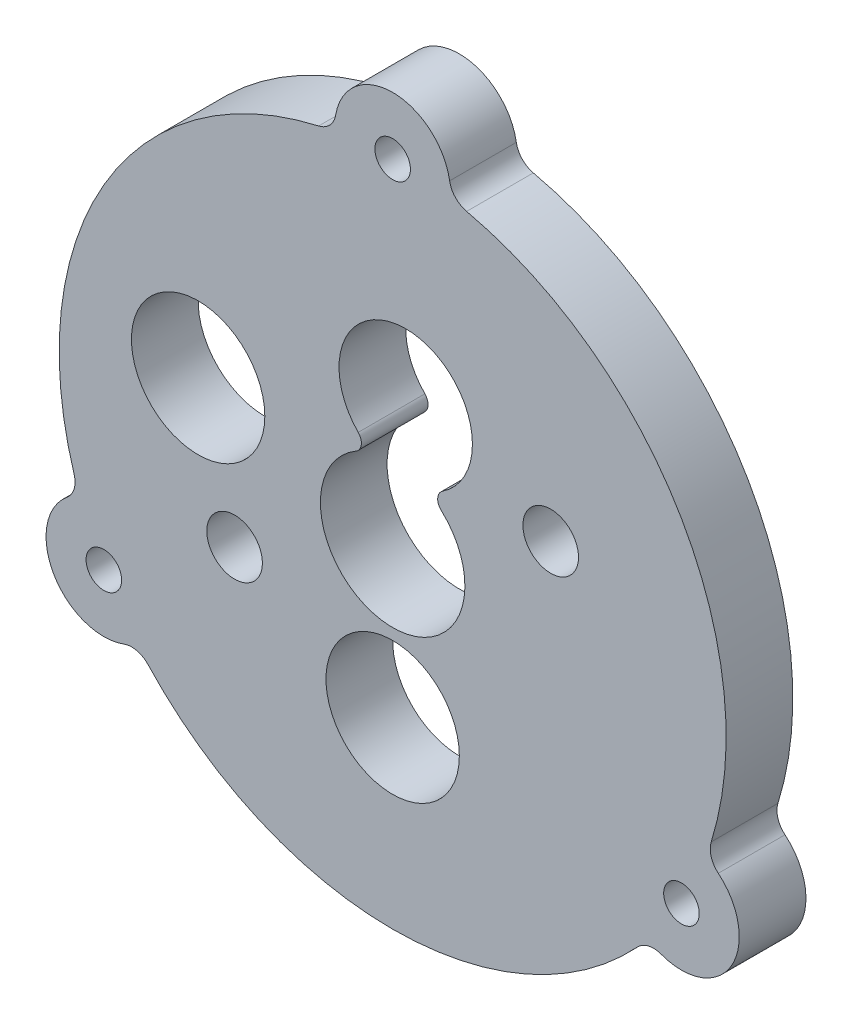
ISO-10303-21;
HEADER;
FILE_DESCRIPTION(('STEP AP214'),'2;1');
FILE_NAME('part.step','',(''),(''),'','','');
FILE_SCHEMA(('AUTOMOTIVE_DESIGN { 1 0 10303 214 1 1 1 1 }'));
ENDSEC;
DATA;
#1=APPLICATION_CONTEXT('core data for automotive mechanical design processes');
#2=APPLICATION_PROTOCOL_DEFINITION('international standard','automotive_design',2000,#1);
#3=PRODUCT_CONTEXT('',#1,'mechanical');
#4=PRODUCT('Part','Part','',(#3));
#5=PRODUCT_RELATED_PRODUCT_CATEGORY('part','',(#4));
#6=PRODUCT_DEFINITION_FORMATION('','',#4);
#7=PRODUCT_DEFINITION_CONTEXT('part definition',#1,'design');
#8=PRODUCT_DEFINITION('design','',#6,#7);
#9=PRODUCT_DEFINITION_SHAPE('','',#8);
#10=(LENGTH_UNIT() NAMED_UNIT(*) SI_UNIT(.MILLI.,.METRE.));
#11=(NAMED_UNIT(*) PLANE_ANGLE_UNIT() SI_UNIT($,.RADIAN.));
#12=(NAMED_UNIT(*) SI_UNIT($,.STERADIAN.) SOLID_ANGLE_UNIT());
#13=UNCERTAINTY_MEASURE_WITH_UNIT(LENGTH_MEASURE(1.E-05),#10,'distance_accuracy_value','');
#14=(GEOMETRIC_REPRESENTATION_CONTEXT(3) GLOBAL_UNCERTAINTY_ASSIGNED_CONTEXT((#13)) GLOBAL_UNIT_ASSIGNED_CONTEXT((#10,
#11,#12)) REPRESENTATION_CONTEXT('',''));
#15=CARTESIAN_POINT('',(0.,0.,0.));
#16=DIRECTION('',(0.,0.,1.));
#17=DIRECTION('',(1.,0.,0.));
#18=AXIS2_PLACEMENT_3D('',#15,#16,#17);
#19=CARTESIAN_POINT('',(6.49519052838329,-3.75,3.));
#20=DIRECTION('',(0.,0.,1.));
#21=DIRECTION('',(1.,0.,0.));
#22=AXIS2_PLACEMENT_3D('',#19,#20,#21);
#23=PLANE('',#22);
#24=CARTESIAN_POINT('',(-12.9903810567665,-7.50000000000007,3.));
#25=DIRECTION('',(0.,0.,1.));
#26=DIRECTION('',(1.,0.,0.));
#27=AXIS2_PLACEMENT_3D('',#24,#25,#26);
#28=CIRCLE('',#27,0.799999999999999);
#29=CARTESIAN_POINT('',(-12.1903810567665,-7.50000000000007,3.));
#30=VERTEX_POINT('',#29);
#31=EDGE_CURVE('E387',#30,#30,#28,.T.);
#32=ORIENTED_EDGE('',*,*,#31,.F.);
#33=EDGE_LOOP('',(#32));
#34=FACE_BOUND('',#33,.T.);
#35=CARTESIAN_POINT('',(0.,15.,3.));
#36=DIRECTION('',(0.,0.,1.));
#37=DIRECTION('',(1.,0.,0.));
#38=AXIS2_PLACEMENT_3D('',#35,#36,#37);
#39=CIRCLE('',#38,0.8);
#40=CARTESIAN_POINT('',(0.799999999999931,15.,3.));
#41=VERTEX_POINT('',#40);
#42=EDGE_CURVE('E399',#41,#41,#39,.T.);
#43=ORIENTED_EDGE('',*,*,#42,.F.);
#44=EDGE_LOOP('',(#43));
#45=FACE_BOUND('',#44,.T.);
#46=CARTESIAN_POINT('',(0.587451619357943,5.6861328633508,3.));
#47=DIRECTION('',(0.,0.,1.));
#48=DIRECTION('',(1.,0.,0.));
#49=AXIS2_PLACEMENT_3D('',#46,#47,#48);
#50=CIRCLE('',#49,3.);
#51=CARTESIAN_POINT('',(2.24883958940588,3.18817569538734,3.));
#52=VERTEX_POINT('',#51);
#53=CARTESIAN_POINT('',(-1.5495371156463,3.58059750471514,3.));
#54=VERTEX_POINT('',#53);
#55=EDGE_CURVE('E411',#52,#54,#50,.T.);
#56=ORIENTED_EDGE('',*,*,#55,.F.);
#57=CARTESIAN_POINT('',(2.52573758441387,2.77184950072676,3.));
#58=DIRECTION('',(0.,0.,1.));
#59=DIRECTION('',(1.,0.,0.));
#60=AXIS2_PLACEMENT_3D('',#57,#58,#59);
#61=CIRCLE('',#60,0.5);
#62=CARTESIAN_POINT('',(2.18897257315868,2.40226956729653,3.));
#63=VERTEX_POINT('',#62);
#64=EDGE_CURVE('E189',#52,#63,#61,.T.);
#65=ORIENTED_EDGE('',*,*,#64,.T.);
#66=CARTESIAN_POINT('',(0.,0.,3.));
#67=DIRECTION('',(0.,0.,1.));
#68=DIRECTION('',(1.,0.,0.));
#69=AXIS2_PLACEMENT_3D('',#66,#67,#68);
#70=CIRCLE('',#69,3.25);
#71=CARTESIAN_POINT('',(-1.65160831750518,2.79905161895019,3.));
#72=VERTEX_POINT('',#71);
#73=EDGE_CURVE('E409',#72,#63,#70,.T.);
#74=ORIENTED_EDGE('',*,*,#73,.F.);
#75=CARTESIAN_POINT('',(-1.90570190481367,3.22967494494253,3.));
#76=DIRECTION('',(0.,0.,1.));
#77=DIRECTION('',(1.,0.,0.));
#78=AXIS2_PLACEMENT_3D('',#75,#76,#77);
#79=CIRCLE('',#78,0.5);
#80=EDGE_CURVE('E172',#72,#54,#79,.T.);
#81=ORIENTED_EDGE('',*,*,#80,.T.);
#82=EDGE_LOOP('',(#56,#65,#74,#81));
#83=FACE_BOUND('',#82,.T.);
#84=CARTESIAN_POINT('',(-7.10922589184212,-3.66863833305516,3.));
#85=DIRECTION('',(0.,0.,1.));
#86=DIRECTION('',(1.,0.,0.));
#87=AXIS2_PLACEMENT_3D('',#84,#85,#86);
#88=CIRCLE('',#87,1.25);
#89=CARTESIAN_POINT('',(-5.85922589184212,-3.66863833305516,3.));
#90=VERTEX_POINT('',#89);
#91=EDGE_CURVE('E416',#90,#90,#88,.T.);
#92=ORIENTED_EDGE('',*,*,#91,.F.);
#93=EDGE_LOOP('',(#92));
#94=FACE_BOUND('',#93,.T.);
#95=CARTESIAN_POINT('',(-12.9903810567665,-7.50000000000007,3.));
#96=DIRECTION('',(0.,0.,1.));
#97=DIRECTION('',(-1.,0.,0.));
#98=AXIS2_PLACEMENT_3D('',#95,#96,#97);
#99=CIRCLE('',#98,2.6);
#100=CARTESIAN_POINT('',(-14.6482284902248,-5.49711660664538,3.));
#101=VERTEX_POINT('',#100);
#102=CARTESIAN_POINT('',(-12.0847568740325,-9.93717968965105,3.));
#103=VERTEX_POINT('',#102);
#104=EDGE_CURVE('E173',#101,#103,#99,.T.);
#105=ORIENTED_EDGE('',*,*,#104,.T.);
#106=CARTESIAN_POINT('',(-11.7364398806732,-10.874556493363,3.));
#107=DIRECTION('',(0.,0.,1.));
#108=DIRECTION('',(1.,0.,0.));
#109=AXIS2_PLACEMENT_3D('',#106,#107,#108);
#110=CIRCLE('',#109,1.);
#111=CARTESIAN_POINT('',(-11.0029123881312,-10.1948967125278,3.));
#112=VERTEX_POINT('',#111);
#113=EDGE_CURVE('E222',#103,#112,#110,.F.);
#114=ORIENTED_EDGE('',*,*,#113,.T.);
#115=CARTESIAN_POINT('',(0.,0.,3.));
#116=DIRECTION('',(0.,0.,1.));
#117=DIRECTION('',(1.,0.,0.));
#118=AXIS2_PLACEMENT_3D('',#115,#116,#117);
#119=CIRCLE('',#118,15.);
#120=CARTESIAN_POINT('',(11.0029123881312,-10.1948967125277,3.));
#121=VERTEX_POINT('',#120);
#122=EDGE_CURVE('E278',#112,#121,#119,.T.);
#123=ORIENTED_EDGE('',*,*,#122,.T.);
#124=CARTESIAN_POINT('',(11.7364398806733,-10.8745564933629,3.));
#125=DIRECTION('',(0.,0.,1.));
#126=DIRECTION('',(1.,0.,0.));
#127=AXIS2_PLACEMENT_3D('',#124,#125,#126);
#128=CIRCLE('',#127,1.);
#129=CARTESIAN_POINT('',(12.0847568740325,-9.93717968965099,3.));
#130=VERTEX_POINT('',#129);
#131=EDGE_CURVE('E55',#121,#130,#128,.F.);
#132=ORIENTED_EDGE('',*,*,#131,.T.);
#133=CARTESIAN_POINT('',(12.9903810567666,-7.50000000000001,3.));
#134=DIRECTION('',(0.,0.,1.));
#135=DIRECTION('',(-1.,0.,0.));
#136=AXIS2_PLACEMENT_3D('',#133,#134,#135);
#137=CIRCLE('',#136,2.59999999999999);
#138=CARTESIAN_POINT('',(14.6482284902248,-5.49711660664532,3.));
#139=VERTEX_POINT('',#138);
#140=EDGE_CURVE('E282',#130,#139,#137,.T.);
#141=ORIENTED_EDGE('',*,*,#140,.T.);
#142=CARTESIAN_POINT('',(15.285862118478,-4.72677683997044,3.));
#143=DIRECTION('',(0.,0.,1.));
#144=DIRECTION('',(1.,0.,0.));
#145=AXIS2_PLACEMENT_3D('',#142,#143,#144);
#146=CIRCLE('',#145,1.);
#147=CARTESIAN_POINT('',(14.3304957360731,-4.43135328747228,3.));
#148=VERTEX_POINT('',#147);
#149=EDGE_CURVE('E234',#139,#148,#146,.F.);
#150=ORIENTED_EDGE('',*,*,#149,.T.);
#151=CARTESIAN_POINT('',(0.,0.,3.));
#152=DIRECTION('',(0.,0.,1.));
#153=DIRECTION('',(1.,0.,0.));
#154=AXIS2_PLACEMENT_3D('',#151,#152,#153);
#155=CIRCLE('',#154,15.);
#156=CARTESIAN_POINT('',(3.32758334794207,14.62625,3.));
#157=VERTEX_POINT('',#156);
#158=EDGE_CURVE('E266',#148,#157,#155,.T.);
#159=ORIENTED_EDGE('',*,*,#158,.T.);
#160=CARTESIAN_POINT('',(3.54942223780487,15.6013333333333,3.));
#161=DIRECTION('',(0.,0.,1.));
#162=DIRECTION('',(1.,0.,0.));
#163=AXIS2_PLACEMENT_3D('',#160,#161,#162);
#164=CIRCLE('',#163,1.);
#165=CARTESIAN_POINT('',(2.56347161619246,15.4342962962963,3.));
#166=VERTEX_POINT('',#165);
#167=EDGE_CURVE('E230',#157,#166,#164,.F.);
#168=ORIENTED_EDGE('',*,*,#167,.T.);
#169=CARTESIAN_POINT('',(0.,15.,3.));
#170=DIRECTION('',(0.,0.,1.));
#171=DIRECTION('',(-1.,0.,0.));
#172=AXIS2_PLACEMENT_3D('',#169,#170,#171);
#173=CIRCLE('',#172,2.60000000000013);
#174=CARTESIAN_POINT('',(-2.56347161619232,15.4342962962963,3.));
#175=VERTEX_POINT('',#174);
#176=EDGE_CURVE('E261',#166,#175,#173,.T.);
#177=ORIENTED_EDGE('',*,*,#176,.T.);
#178=CARTESIAN_POINT('',(-3.54942223780473,15.6013333333333,3.));
#179=DIRECTION('',(0.,0.,1.));
#180=DIRECTION('',(1.,0.,0.));
#181=AXIS2_PLACEMENT_3D('',#178,#179,#180);
#182=CIRCLE('',#181,1.);
#183=CARTESIAN_POINT('',(-3.32758334794193,14.62625,3.));
#184=VERTEX_POINT('',#183);
#185=EDGE_CURVE('E11',#175,#184,#182,.F.);
#186=ORIENTED_EDGE('',*,*,#185,.T.);
#187=CARTESIAN_POINT('',(0.,0.,3.));
#188=DIRECTION('',(0.,0.,1.));
#189=DIRECTION('',(1.,0.,0.));
#190=AXIS2_PLACEMENT_3D('',#187,#188,#189);
#191=CIRCLE('',#190,15.);
#192=CARTESIAN_POINT('',(-14.3304957360731,-4.43135328747235,3.));
#193=VERTEX_POINT('',#192);
#194=EDGE_CURVE('E177',#184,#193,#191,.T.);
#195=ORIENTED_EDGE('',*,*,#194,.T.);
#196=CARTESIAN_POINT('',(-15.2858621184779,-4.7267768399705,3.));
#197=DIRECTION('',(0.,0.,1.));
#198=DIRECTION('',(1.,0.,0.));
#199=AXIS2_PLACEMENT_3D('',#196,#197,#198);
#200=CIRCLE('',#199,1.);
#201=EDGE_CURVE('E226',#193,#101,#200,.F.);
#202=ORIENTED_EDGE('',*,*,#201,.T.);
#203=EDGE_LOOP('',(#105,#114,#123,#132,#141,#150,#159,#168,#177,#186,#195,#202));
#204=FACE_BOUND('',#203,.T.);
#205=CARTESIAN_POINT('',(-8.74996888883358,2.10666666666667,3.));
#206=DIRECTION('',(0.,0.,1.));
#207=DIRECTION('',(1.,0.,0.));
#208=AXIS2_PLACEMENT_3D('',#205,#206,#207);
#209=CIRCLE('',#208,3.);
#210=CARTESIAN_POINT('',(-5.74996888883358,2.10666666666667,3.));
#211=VERTEX_POINT('',#210);
#212=EDGE_CURVE('E274',#211,#211,#209,.T.);
#213=ORIENTED_EDGE('',*,*,#212,.F.);
#214=EDGE_LOOP('',(#213));
#215=FACE_BOUND('',#214,.T.);
#216=CARTESIAN_POINT('',(0.,-6.75,3.));
#217=DIRECTION('',(0.,0.,1.));
#218=DIRECTION('',(1.,0.,0.));
#219=AXIS2_PLACEMENT_3D('',#216,#217,#218);
#220=CIRCLE('',#219,3.);
#221=CARTESIAN_POINT('',(3.,-6.75,3.));
#222=VERTEX_POINT('',#221);
#223=EDGE_CURVE('E168',#222,#222,#220,.T.);
#224=ORIENTED_EDGE('',*,*,#223,.F.);
#225=EDGE_LOOP('',(#224));
#226=FACE_BOUND('',#225,.T.);
#227=CARTESIAN_POINT('',(12.9903810567666,-7.50000000000001,3.));
#228=DIRECTION('',(0.,0.,1.));
#229=DIRECTION('',(1.,0.,0.));
#230=AXIS2_PLACEMENT_3D('',#227,#228,#229);
#231=CIRCLE('',#230,0.800000000000057);
#232=CARTESIAN_POINT('',(13.7903810567666,-7.50000000000001,3.));
#233=VERTEX_POINT('',#232);
#234=EDGE_CURVE('E393',#233,#233,#231,.T.);
#235=ORIENTED_EDGE('',*,*,#234,.F.);
#236=EDGE_LOOP('',(#235));
#237=FACE_BOUND('',#236,.T.);
#238=CARTESIAN_POINT('',(7.10922589184211,3.66863833305516,3.));
#239=DIRECTION('',(0.,0.,1.));
#240=DIRECTION('',(1.,0.,0.));
#241=AXIS2_PLACEMENT_3D('',#238,#239,#240);
#242=CIRCLE('',#241,1.25);
#243=CARTESIAN_POINT('',(8.35922589184211,3.66863833305516,3.));
#244=VERTEX_POINT('',#243);
#245=EDGE_CURVE('E378',#244,#244,#242,.T.);
#246=ORIENTED_EDGE('',*,*,#245,.F.);
#247=EDGE_LOOP('',(#246));
#248=FACE_BOUND('',#247,.T.);
#249=ADVANCED_FACE('F33',(#34,#45,#83,#94,#204,#215,#226,#237,#248),#23,.T.);
#250=CARTESIAN_POINT('',(6.49519052838329,-3.75,0.));
#251=DIRECTION('',(0.,0.,1.));
#252=DIRECTION('',(1.,0.,0.));
#253=AXIS2_PLACEMENT_3D('',#250,#251,#252);
#254=PLANE('',#253);
#255=CARTESIAN_POINT('',(-7.10922589184212,-3.66863833305516,0.));
#256=DIRECTION('',(0.,0.,1.));
#257=DIRECTION('',(1.,0.,0.));
#258=AXIS2_PLACEMENT_3D('',#255,#256,#257);
#259=CIRCLE('',#258,1.25);
#260=CARTESIAN_POINT('',(-5.85922589184212,-3.66863833305516,0.));
#261=VERTEX_POINT('',#260);
#262=EDGE_CURVE('E413',#261,#261,#259,.T.);
#263=ORIENTED_EDGE('',*,*,#262,.T.);
#264=EDGE_LOOP('',(#263));
#265=FACE_BOUND('',#264,.T.);
#266=CARTESIAN_POINT('',(-8.74996888883358,2.10666666666667,0.));
#267=DIRECTION('',(0.,0.,1.));
#268=DIRECTION('',(1.,0.,0.));
#269=AXIS2_PLACEMENT_3D('',#266,#267,#268);
#270=CIRCLE('',#269,3.);
#271=CARTESIAN_POINT('',(-5.74996888883358,2.10666666666667,0.));
#272=VERTEX_POINT('',#271);
#273=EDGE_CURVE('E287',#272,#272,#270,.T.);
#274=ORIENTED_EDGE('',*,*,#273,.T.);
#275=EDGE_LOOP('',(#274));
#276=FACE_BOUND('',#275,.T.);
#277=CARTESIAN_POINT('',(0.,0.,0.));
#278=DIRECTION('',(0.,0.,1.));
#279=DIRECTION('',(1.,0.,0.));
#280=AXIS2_PLACEMENT_3D('',#277,#278,#279);
#281=CIRCLE('',#280,15.);
#282=CARTESIAN_POINT('',(-11.0029123881312,-10.1948967125278,0.));
#283=VERTEX_POINT('',#282);
#284=CARTESIAN_POINT('',(11.0029123881312,-10.1948967125277,0.));
#285=VERTEX_POINT('',#284);
#286=EDGE_CURVE('E270',#283,#285,#281,.T.);
#287=ORIENTED_EDGE('',*,*,#286,.F.);
#288=CARTESIAN_POINT('',(-11.7364398806732,-10.874556493363,0.));
#289=DIRECTION('',(0.,0.,1.));
#290=DIRECTION('',(1.,0.,0.));
#291=AXIS2_PLACEMENT_3D('',#288,#289,#290);
#292=CIRCLE('',#291,1.);
#293=CARTESIAN_POINT('',(-12.0847568740325,-9.93717968965105,0.));
#294=VERTEX_POINT('',#293);
#295=EDGE_CURVE('E220',#283,#294,#292,.T.);
#296=ORIENTED_EDGE('',*,*,#295,.T.);
#297=CARTESIAN_POINT('',(-12.9903810567665,-7.50000000000007,0.));
#298=DIRECTION('',(0.,0.,1.));
#299=DIRECTION('',(-1.,0.,0.));
#300=AXIS2_PLACEMENT_3D('',#297,#298,#299);
#301=CIRCLE('',#300,2.6);
#302=CARTESIAN_POINT('',(-14.6482284902248,-5.49711660664538,0.));
#303=VERTEX_POINT('',#302);
#304=EDGE_CURVE('E180',#303,#294,#301,.T.);
#305=ORIENTED_EDGE('',*,*,#304,.F.);
#306=CARTESIAN_POINT('',(-15.2858621184779,-4.7267768399705,0.));
#307=DIRECTION('',(0.,0.,1.));
#308=DIRECTION('',(1.,0.,0.));
#309=AXIS2_PLACEMENT_3D('',#306,#307,#308);
#310=CIRCLE('',#309,1.);
#311=CARTESIAN_POINT('',(-14.3304957360731,-4.43135328747235,0.));
#312=VERTEX_POINT('',#311);
#313=EDGE_CURVE('E224',#303,#312,#310,.T.);
#314=ORIENTED_EDGE('',*,*,#313,.T.);
#315=CARTESIAN_POINT('',(0.,0.,0.));
#316=DIRECTION('',(0.,0.,1.));
#317=DIRECTION('',(1.,0.,0.));
#318=AXIS2_PLACEMENT_3D('',#315,#316,#317);
#319=CIRCLE('',#318,15.);
#320=CARTESIAN_POINT('',(-3.32758334794193,14.62625,0.));
#321=VERTEX_POINT('',#320);
#322=EDGE_CURVE('E245',#321,#312,#319,.T.);
#323=ORIENTED_EDGE('',*,*,#322,.F.);
#324=CARTESIAN_POINT('',(-3.54942223780473,15.6013333333333,0.));
#325=DIRECTION('',(0.,0.,1.));
#326=DIRECTION('',(1.,0.,0.));
#327=AXIS2_PLACEMENT_3D('',#324,#325,#326);
#328=CIRCLE('',#327,1.);
#329=CARTESIAN_POINT('',(-2.56347161619232,15.4342962962963,0.));
#330=VERTEX_POINT('',#329);
#331=EDGE_CURVE('E41',#321,#330,#328,.T.);
#332=ORIENTED_EDGE('',*,*,#331,.T.);
#333=CARTESIAN_POINT('',(0.,15.,0.));
#334=DIRECTION('',(0.,0.,1.));
#335=DIRECTION('',(-1.,0.,0.));
#336=AXIS2_PLACEMENT_3D('',#333,#334,#335);
#337=CIRCLE('',#336,2.60000000000013);
#338=CARTESIAN_POINT('',(2.56347161619246,15.4342962962963,0.));
#339=VERTEX_POINT('',#338);
#340=EDGE_CURVE('E243',#339,#330,#337,.T.);
#341=ORIENTED_EDGE('',*,*,#340,.F.);
#342=CARTESIAN_POINT('',(3.54942223780487,15.6013333333333,0.));
#343=DIRECTION('',(0.,0.,1.));
#344=DIRECTION('',(1.,0.,0.));
#345=AXIS2_PLACEMENT_3D('',#342,#343,#344);
#346=CIRCLE('',#345,1.);
#347=CARTESIAN_POINT('',(3.32758334794207,14.62625,0.));
#348=VERTEX_POINT('',#347);
#349=EDGE_CURVE('E228',#339,#348,#346,.T.);
#350=ORIENTED_EDGE('',*,*,#349,.T.);
#351=CARTESIAN_POINT('',(0.,0.,0.));
#352=DIRECTION('',(0.,0.,1.));
#353=DIRECTION('',(1.,0.,0.));
#354=AXIS2_PLACEMENT_3D('',#351,#352,#353);
#355=CIRCLE('',#354,15.);
#356=CARTESIAN_POINT('',(14.3304957360731,-4.43135328747228,0.));
#357=VERTEX_POINT('',#356);
#358=EDGE_CURVE('E254',#357,#348,#355,.T.);
#359=ORIENTED_EDGE('',*,*,#358,.F.);
#360=CARTESIAN_POINT('',(15.285862118478,-4.72677683997044,0.));
#361=DIRECTION('',(0.,0.,1.));
#362=DIRECTION('',(1.,0.,0.));
#363=AXIS2_PLACEMENT_3D('',#360,#361,#362);
#364=CIRCLE('',#363,1.);
#365=CARTESIAN_POINT('',(14.6482284902248,-5.49711660664532,0.));
#366=VERTEX_POINT('',#365);
#367=EDGE_CURVE('E232',#357,#366,#364,.T.);
#368=ORIENTED_EDGE('',*,*,#367,.T.);
#369=CARTESIAN_POINT('',(12.9903810567666,-7.50000000000001,0.));
#370=DIRECTION('',(0.,0.,1.));
#371=DIRECTION('',(-1.,0.,0.));
#372=AXIS2_PLACEMENT_3D('',#369,#370,#371);
#373=CIRCLE('',#372,2.59999999999999);
#374=CARTESIAN_POINT('',(12.0847568740325,-9.93717968965099,0.));
#375=VERTEX_POINT('',#374);
#376=EDGE_CURVE('E273',#375,#366,#373,.T.);
#377=ORIENTED_EDGE('',*,*,#376,.F.);
#378=CARTESIAN_POINT('',(11.7364398806733,-10.8745564933629,0.));
#379=DIRECTION('',(0.,0.,1.));
#380=DIRECTION('',(1.,0.,0.));
#381=AXIS2_PLACEMENT_3D('',#378,#379,#380);
#382=CIRCLE('',#381,1.);
#383=EDGE_CURVE('E236',#375,#285,#382,.T.);
#384=ORIENTED_EDGE('',*,*,#383,.T.);
#385=EDGE_LOOP('',(#287,#296,#305,#314,#323,#332,#341,#350,#359,#368,#377,#384));
#386=FACE_BOUND('',#385,.T.);
#387=CARTESIAN_POINT('',(0.,0.,0.));
#388=DIRECTION('',(0.,0.,1.));
#389=DIRECTION('',(1.,0.,0.));
#390=AXIS2_PLACEMENT_3D('',#387,#388,#389);
#391=CIRCLE('',#390,3.25);
#392=CARTESIAN_POINT('',(-1.65160831750518,2.79905161895019,0.));
#393=VERTEX_POINT('',#392);
#394=CARTESIAN_POINT('',(2.18897257315868,2.40226956729653,0.));
#395=VERTEX_POINT('',#394);
#396=EDGE_CURVE('E151',#393,#395,#391,.T.);
#397=ORIENTED_EDGE('',*,*,#396,.T.);
#398=CARTESIAN_POINT('',(2.52573758441387,2.77184950072676,0.));
#399=DIRECTION('',(0.,0.,1.));
#400=DIRECTION('',(1.,0.,0.));
#401=AXIS2_PLACEMENT_3D('',#398,#399,#400);
#402=CIRCLE('',#401,0.5);
#403=CARTESIAN_POINT('',(2.24883958940588,3.18817569538734,0.));
#404=VERTEX_POINT('',#403);
#405=EDGE_CURVE('E158',#395,#404,#402,.F.);
#406=ORIENTED_EDGE('',*,*,#405,.T.);
#407=CARTESIAN_POINT('',(0.587451619357943,5.6861328633508,0.));
#408=DIRECTION('',(0.,0.,1.));
#409=DIRECTION('',(1.,0.,0.));
#410=AXIS2_PLACEMENT_3D('',#407,#408,#409);
#411=CIRCLE('',#410,3.);
#412=CARTESIAN_POINT('',(-1.5495371156463,3.58059750471514,0.));
#413=VERTEX_POINT('',#412);
#414=EDGE_CURVE('E153',#404,#413,#411,.T.);
#415=ORIENTED_EDGE('',*,*,#414,.T.);
#416=CARTESIAN_POINT('',(-1.90570190481367,3.22967494494253,0.));
#417=DIRECTION('',(0.,0.,1.));
#418=DIRECTION('',(1.,0.,0.));
#419=AXIS2_PLACEMENT_3D('',#416,#417,#418);
#420=CIRCLE('',#419,0.5);
#421=EDGE_CURVE('E147',#413,#393,#420,.F.);
#422=ORIENTED_EDGE('',*,*,#421,.T.);
#423=EDGE_LOOP('',(#397,#406,#415,#422));
#424=FACE_BOUND('',#423,.T.);
#425=CARTESIAN_POINT('',(0.,-6.75,0.));
#426=DIRECTION('',(0.,0.,1.));
#427=DIRECTION('',(1.,0.,0.));
#428=AXIS2_PLACEMENT_3D('',#425,#426,#427);
#429=CIRCLE('',#428,3.);
#430=CARTESIAN_POINT('',(3.,-6.75,0.));
#431=VERTEX_POINT('',#430);
#432=EDGE_CURVE('E402',#431,#431,#429,.T.);
#433=ORIENTED_EDGE('',*,*,#432,.T.);
#434=EDGE_LOOP('',(#433));
#435=FACE_BOUND('',#434,.T.);
#436=CARTESIAN_POINT('',(0.,15.,0.));
#437=DIRECTION('',(0.,0.,1.));
#438=DIRECTION('',(1.,0.,0.));
#439=AXIS2_PLACEMENT_3D('',#436,#437,#438);
#440=CIRCLE('',#439,0.8);
#441=CARTESIAN_POINT('',(0.799999999999931,15.,0.));
#442=VERTEX_POINT('',#441);
#443=EDGE_CURVE('E396',#442,#442,#440,.T.);
#444=ORIENTED_EDGE('',*,*,#443,.T.);
#445=EDGE_LOOP('',(#444));
#446=FACE_BOUND('',#445,.T.);
#447=CARTESIAN_POINT('',(12.9903810567666,-7.50000000000001,0.));
#448=DIRECTION('',(0.,0.,1.));
#449=DIRECTION('',(1.,0.,0.));
#450=AXIS2_PLACEMENT_3D('',#447,#448,#449);
#451=CIRCLE('',#450,0.800000000000057);
#452=CARTESIAN_POINT('',(13.7903810567666,-7.50000000000001,0.));
#453=VERTEX_POINT('',#452);
#454=EDGE_CURVE('E390',#453,#453,#451,.T.);
#455=ORIENTED_EDGE('',*,*,#454,.T.);
#456=EDGE_LOOP('',(#455));
#457=FACE_BOUND('',#456,.T.);
#458=CARTESIAN_POINT('',(-12.9903810567665,-7.50000000000007,0.));
#459=DIRECTION('',(0.,0.,1.));
#460=DIRECTION('',(1.,0.,0.));
#461=AXIS2_PLACEMENT_3D('',#458,#459,#460);
#462=CIRCLE('',#461,0.799999999999999);
#463=CARTESIAN_POINT('',(-12.1903810567665,-7.50000000000007,0.));
#464=VERTEX_POINT('',#463);
#465=EDGE_CURVE('E384',#464,#464,#462,.T.);
#466=ORIENTED_EDGE('',*,*,#465,.T.);
#467=EDGE_LOOP('',(#466));
#468=FACE_BOUND('',#467,.T.);
#469=CARTESIAN_POINT('',(7.10922589184211,3.66863833305516,0.));
#470=DIRECTION('',(0.,0.,1.));
#471=DIRECTION('',(1.,0.,0.));
#472=AXIS2_PLACEMENT_3D('',#469,#470,#471);
#473=CIRCLE('',#472,1.25);
#474=CARTESIAN_POINT('',(8.35922589184211,3.66863833305516,0.));
#475=VERTEX_POINT('',#474);
#476=EDGE_CURVE('E381',#475,#475,#473,.T.);
#477=ORIENTED_EDGE('',*,*,#476,.T.);
#478=EDGE_LOOP('',(#477));
#479=FACE_BOUND('',#478,.T.);
#480=ADVANCED_FACE('F149',(#265,#276,#386,#424,#435,#446,#457,#468,#479),#254,.F.);
#481=CARTESIAN_POINT('',(0.,0.,3.));
#482=DIRECTION('',(0.,0.,-1.));
#483=DIRECTION('',(-1.,0.,0.));
#484=AXIS2_PLACEMENT_3D('',#481,#482,#483);
#485=CYLINDRICAL_SURFACE('',#484,15.);
#486=ORIENTED_EDGE('',*,*,#122,.F.);
#487=DIRECTION('',(0.,0.,-1.));
#488=VECTOR('',#487,1.);
#489=CARTESIAN_POINT('',(-11.0029123881312,-10.1948967125278,3.));
#490=LINE('',#489,#488);
#491=EDGE_CURVE('E193',#112,#283,#490,.T.);
#492=ORIENTED_EDGE('',*,*,#491,.T.);
#493=ORIENTED_EDGE('',*,*,#286,.T.);
#494=DIRECTION('',(0.,0.,-1.));
#495=VECTOR('',#494,1.);
#496=CARTESIAN_POINT('',(11.0029123881312,-10.1948967125277,3.));
#497=LINE('',#496,#495);
#498=EDGE_CURVE('E191',#285,#121,#497,.F.);
#499=ORIENTED_EDGE('',*,*,#498,.T.);
#500=EDGE_LOOP('',(#486,#492,#493,#499));
#501=FACE_BOUND('',#500,.T.);
#502=ADVANCED_FACE('F309',(#501),#485,.T.);
#503=CARTESIAN_POINT('',(12.9903810567666,-7.50000000000001,3.));
#504=DIRECTION('',(0.,0.,-1.));
#505=DIRECTION('',(-1.,0.,0.));
#506=AXIS2_PLACEMENT_3D('',#503,#504,#505);
#507=CYLINDRICAL_SURFACE('',#506,2.59999999999999);
#508=ORIENTED_EDGE('',*,*,#376,.T.);
#509=DIRECTION('',(0.,0.,-1.));
#510=VECTOR('',#509,1.);
#511=CARTESIAN_POINT('',(14.6482284902248,-5.49711660664532,3.));
#512=LINE('',#511,#510);
#513=EDGE_CURVE('E48',#366,#139,#512,.F.);
#514=ORIENTED_EDGE('',*,*,#513,.T.);
#515=ORIENTED_EDGE('',*,*,#140,.F.);
#516=DIRECTION('',(0.,0.,-1.));
#517=VECTOR('',#516,1.);
#518=CARTESIAN_POINT('',(12.0847568740325,-9.93717968965099,3.));
#519=LINE('',#518,#517);
#520=EDGE_CURVE('E216',#130,#375,#519,.T.);
#521=ORIENTED_EDGE('',*,*,#520,.T.);
#522=EDGE_LOOP('',(#508,#514,#515,#521));
#523=FACE_BOUND('',#522,.T.);
#524=ADVANCED_FACE('F303',(#523),#507,.T.);
#525=CARTESIAN_POINT('',(0.,0.,3.));
#526=DIRECTION('',(0.,0.,-1.));
#527=DIRECTION('',(-1.,0.,0.));
#528=AXIS2_PLACEMENT_3D('',#525,#526,#527);
#529=CYLINDRICAL_SURFACE('',#528,15.);
#530=ORIENTED_EDGE('',*,*,#358,.T.);
#531=DIRECTION('',(0.,0.,-1.));
#532=VECTOR('',#531,1.);
#533=CARTESIAN_POINT('',(3.32758334794207,14.62625,3.));
#534=LINE('',#533,#532);
#535=EDGE_CURVE('E214',#348,#157,#534,.F.);
#536=ORIENTED_EDGE('',*,*,#535,.T.);
#537=ORIENTED_EDGE('',*,*,#158,.F.);
#538=DIRECTION('',(0.,0.,-1.));
#539=VECTOR('',#538,1.);
#540=CARTESIAN_POINT('',(14.3304957360731,-4.43135328747229,3.));
#541=LINE('',#540,#539);
#542=EDGE_CURVE('E211',#148,#357,#541,.T.);
#543=ORIENTED_EDGE('',*,*,#542,.T.);
#544=EDGE_LOOP('',(#530,#536,#537,#543));
#545=FACE_BOUND('',#544,.T.);
#546=ADVANCED_FACE('F299',(#545),#529,.T.);
#547=CARTESIAN_POINT('',(0.,15.,3.));
#548=DIRECTION('',(0.,0.,-1.));
#549=DIRECTION('',(-1.,0.,0.));
#550=AXIS2_PLACEMENT_3D('',#547,#548,#549);
#551=CYLINDRICAL_SURFACE('',#550,2.60000000000013);
#552=ORIENTED_EDGE('',*,*,#176,.F.);
#553=DIRECTION('',(0.,0.,-1.));
#554=VECTOR('',#553,1.);
#555=CARTESIAN_POINT('',(2.56347161619246,15.4342962962963,3.));
#556=LINE('',#555,#554);
#557=EDGE_CURVE('E208',#166,#339,#556,.T.);
#558=ORIENTED_EDGE('',*,*,#557,.T.);
#559=ORIENTED_EDGE('',*,*,#340,.T.);
#560=DIRECTION('',(0.,0.,-1.));
#561=VECTOR('',#560,1.);
#562=CARTESIAN_POINT('',(-2.56347161619232,15.4342962962963,3.));
#563=LINE('',#562,#561);
#564=EDGE_CURVE('E206',#330,#175,#563,.F.);
#565=ORIENTED_EDGE('',*,*,#564,.T.);
#566=EDGE_LOOP('',(#552,#558,#559,#565));
#567=FACE_BOUND('',#566,.T.);
#568=ADVANCED_FACE('F251',(#567),#551,.T.);
#569=CARTESIAN_POINT('',(0.,0.,3.));
#570=DIRECTION('',(0.,0.,-1.));
#571=DIRECTION('',(-1.,0.,0.));
#572=AXIS2_PLACEMENT_3D('',#569,#570,#571);
#573=CYLINDRICAL_SURFACE('',#572,15.);
#574=ORIENTED_EDGE('',*,*,#322,.T.);
#575=DIRECTION('',(0.,0.,-1.));
#576=VECTOR('',#575,1.);
#577=CARTESIAN_POINT('',(-14.3304957360731,-4.43135328747235,3.));
#578=LINE('',#577,#576);
#579=EDGE_CURVE('E204',#312,#193,#578,.F.);
#580=ORIENTED_EDGE('',*,*,#579,.T.);
#581=ORIENTED_EDGE('',*,*,#194,.F.);
#582=DIRECTION('',(0.,0.,-1.));
#583=VECTOR('',#582,1.);
#584=CARTESIAN_POINT('',(-3.32758334794193,14.62625,3.));
#585=LINE('',#584,#583);
#586=EDGE_CURVE('E201',#184,#321,#585,.T.);
#587=ORIENTED_EDGE('',*,*,#586,.T.);
#588=EDGE_LOOP('',(#574,#580,#581,#587));
#589=FACE_BOUND('',#588,.T.);
#590=ADVANCED_FACE('F263',(#589),#573,.T.);
#591=CARTESIAN_POINT('',(-12.9903810567665,-7.50000000000007,3.));
#592=DIRECTION('',(0.,0.,-1.));
#593=DIRECTION('',(-1.,0.,0.));
#594=AXIS2_PLACEMENT_3D('',#591,#592,#593);
#595=CYLINDRICAL_SURFACE('',#594,2.6);
#596=ORIENTED_EDGE('',*,*,#304,.T.);
#597=DIRECTION('',(0.,0.,-1.));
#598=VECTOR('',#597,1.);
#599=CARTESIAN_POINT('',(-12.0847568740325,-9.93717968965105,3.));
#600=LINE('',#599,#598);
#601=EDGE_CURVE('E199',#294,#103,#600,.F.);
#602=ORIENTED_EDGE('',*,*,#601,.T.);
#603=ORIENTED_EDGE('',*,*,#104,.F.);
#604=DIRECTION('',(0.,0.,-1.));
#605=VECTOR('',#604,1.);
#606=CARTESIAN_POINT('',(-14.6482284902248,-5.49711660664538,3.));
#607=LINE('',#606,#605);
#608=EDGE_CURVE('E196',#101,#303,#607,.T.);
#609=ORIENTED_EDGE('',*,*,#608,.T.);
#610=EDGE_LOOP('',(#596,#602,#603,#609));
#611=FACE_BOUND('',#610,.T.);
#612=ADVANCED_FACE('F318',(#611),#595,.T.);
#613=CARTESIAN_POINT('',(-8.74996888883358,2.10666666666667,3.));
#614=DIRECTION('',(0.,0.,-1.));
#615=DIRECTION('',(-1.,0.,0.));
#616=AXIS2_PLACEMENT_3D('',#613,#614,#615);
#617=CYLINDRICAL_SURFACE('',#616,3.);
#618=ORIENTED_EDGE('',*,*,#212,.T.);
#619=EDGE_LOOP('',(#618));
#620=FACE_BOUND('',#619,.T.);
#621=ORIENTED_EDGE('',*,*,#273,.F.);
#622=EDGE_LOOP('',(#621));
#623=FACE_BOUND('',#622,.T.);
#624=ADVANCED_FACE('F320',(#620,#623),#617,.F.);
#625=CARTESIAN_POINT('',(-7.10922589184212,-3.66863833305516,3.));
#626=DIRECTION('',(0.,0.,-1.));
#627=DIRECTION('',(-1.,0.,0.));
#628=AXIS2_PLACEMENT_3D('',#625,#626,#627);
#629=CYLINDRICAL_SURFACE('',#628,1.25);
#630=ORIENTED_EDGE('',*,*,#91,.T.);
#631=EDGE_LOOP('',(#630));
#632=FACE_BOUND('',#631,.T.);
#633=ORIENTED_EDGE('',*,*,#262,.F.);
#634=EDGE_LOOP('',(#633));
#635=FACE_BOUND('',#634,.T.);
#636=ADVANCED_FACE('F326',(#632,#635),#629,.F.);
#637=CARTESIAN_POINT('',(0.,0.,3.));
#638=DIRECTION('',(0.,0.,-1.));
#639=DIRECTION('',(-1.,0.,0.));
#640=AXIS2_PLACEMENT_3D('',#637,#638,#639);
#641=CYLINDRICAL_SURFACE('',#640,3.25);
#642=ORIENTED_EDGE('',*,*,#73,.T.);
#643=DIRECTION('',(0.,0.,-1.));
#644=VECTOR('',#643,1.);
#645=CARTESIAN_POINT('',(2.18897257315868,2.40226956729653,3.));
#646=LINE('',#645,#644);
#647=EDGE_CURVE('E159',#63,#395,#646,.T.);
#648=ORIENTED_EDGE('',*,*,#647,.T.);
#649=ORIENTED_EDGE('',*,*,#396,.F.);
#650=DIRECTION('',(0.,0.,-1.));
#651=VECTOR('',#650,1.);
#652=CARTESIAN_POINT('',(-1.65160831750518,2.79905161895019,3.));
#653=LINE('',#652,#651);
#654=EDGE_CURVE('E165',#393,#72,#653,.F.);
#655=ORIENTED_EDGE('',*,*,#654,.T.);
#656=EDGE_LOOP('',(#642,#648,#649,#655));
#657=FACE_BOUND('',#656,.T.);
#658=ADVANCED_FACE('F164',(#657),#641,.F.);
#659=CARTESIAN_POINT('',(0.587451619357943,5.6861328633508,3.));
#660=DIRECTION('',(0.,0.,-1.));
#661=DIRECTION('',(-1.,0.,0.));
#662=AXIS2_PLACEMENT_3D('',#659,#660,#661);
#663=CYLINDRICAL_SURFACE('',#662,3.);
#664=ORIENTED_EDGE('',*,*,#414,.F.);
#665=DIRECTION('',(0.,0.,-1.));
#666=VECTOR('',#665,1.);
#667=CARTESIAN_POINT('',(2.24883958940588,3.18817569538734,3.));
#668=LINE('',#667,#666);
#669=EDGE_CURVE('E186',#404,#52,#668,.F.);
#670=ORIENTED_EDGE('',*,*,#669,.T.);
#671=ORIENTED_EDGE('',*,*,#55,.T.);
#672=DIRECTION('',(0.,0.,-1.));
#673=VECTOR('',#672,1.);
#674=CARTESIAN_POINT('',(-1.5495371156463,3.58059750471514,3.));
#675=LINE('',#674,#673);
#676=EDGE_CURVE('E184',#54,#413,#675,.T.);
#677=ORIENTED_EDGE('',*,*,#676,.T.);
#678=EDGE_LOOP('',(#664,#670,#671,#677));
#679=FACE_BOUND('',#678,.T.);
#680=ADVANCED_FACE('F346',(#679),#663,.F.);
#681=CARTESIAN_POINT('',(0.,-6.75,3.));
#682=DIRECTION('',(0.,0.,-1.));
#683=DIRECTION('',(-1.,0.,0.));
#684=AXIS2_PLACEMENT_3D('',#681,#682,#683);
#685=CYLINDRICAL_SURFACE('',#684,3.);
#686=ORIENTED_EDGE('',*,*,#223,.T.);
#687=EDGE_LOOP('',(#686));
#688=FACE_BOUND('',#687,.T.);
#689=ORIENTED_EDGE('',*,*,#432,.F.);
#690=EDGE_LOOP('',(#689));
#691=FACE_BOUND('',#690,.T.);
#692=ADVANCED_FACE('F349',(#688,#691),#685,.F.);
#693=CARTESIAN_POINT('',(0.,15.,3.));
#694=DIRECTION('',(0.,0.,-1.));
#695=DIRECTION('',(-1.,0.,0.));
#696=AXIS2_PLACEMENT_3D('',#693,#694,#695);
#697=CYLINDRICAL_SURFACE('',#696,0.8);
#698=ORIENTED_EDGE('',*,*,#42,.T.);
#699=EDGE_LOOP('',(#698));
#700=FACE_BOUND('',#699,.T.);
#701=ORIENTED_EDGE('',*,*,#443,.F.);
#702=EDGE_LOOP('',(#701));
#703=FACE_BOUND('',#702,.T.);
#704=ADVANCED_FACE('F353',(#700,#703),#697,.F.);
#705=CARTESIAN_POINT('',(12.9903810567666,-7.50000000000001,3.));
#706=DIRECTION('',(0.,0.,-1.));
#707=DIRECTION('',(-1.,0.,0.));
#708=AXIS2_PLACEMENT_3D('',#705,#706,#707);
#709=CYLINDRICAL_SURFACE('',#708,0.800000000000057);
#710=ORIENTED_EDGE('',*,*,#234,.T.);
#711=EDGE_LOOP('',(#710));
#712=FACE_BOUND('',#711,.T.);
#713=ORIENTED_EDGE('',*,*,#454,.F.);
#714=EDGE_LOOP('',(#713));
#715=FACE_BOUND('',#714,.T.);
#716=ADVANCED_FACE('F357',(#712,#715),#709,.F.);
#717=CARTESIAN_POINT('',(-12.9903810567665,-7.50000000000007,3.));
#718=DIRECTION('',(0.,0.,-1.));
#719=DIRECTION('',(-1.,0.,0.));
#720=AXIS2_PLACEMENT_3D('',#717,#718,#719);
#721=CYLINDRICAL_SURFACE('',#720,0.799999999999999);
#722=ORIENTED_EDGE('',*,*,#31,.T.);
#723=EDGE_LOOP('',(#722));
#724=FACE_BOUND('',#723,.T.);
#725=ORIENTED_EDGE('',*,*,#465,.F.);
#726=EDGE_LOOP('',(#725));
#727=FACE_BOUND('',#726,.T.);
#728=ADVANCED_FACE('F361',(#724,#727),#721,.F.);
#729=CARTESIAN_POINT('',(7.10922589184211,3.66863833305516,3.));
#730=DIRECTION('',(0.,0.,-1.));
#731=DIRECTION('',(-1.,0.,0.));
#732=AXIS2_PLACEMENT_3D('',#729,#730,#731);
#733=CYLINDRICAL_SURFACE('',#732,1.25);
#734=ORIENTED_EDGE('',*,*,#245,.T.);
#735=EDGE_LOOP('',(#734));
#736=FACE_BOUND('',#735,.T.);
#737=ORIENTED_EDGE('',*,*,#476,.F.);
#738=EDGE_LOOP('',(#737));
#739=FACE_BOUND('',#738,.T.);
#740=ADVANCED_FACE('F365',(#736,#739),#733,.F.);
#741=CARTESIAN_POINT('',(2.52573758441387,2.77184950072676,3.));
#742=DIRECTION('',(0.,0.,-1.));
#743=DIRECTION('',(-1.,0.,0.));
#744=AXIS2_PLACEMENT_3D('',#741,#742,#743);
#745=CYLINDRICAL_SURFACE('',#744,0.5);
#746=ORIENTED_EDGE('',*,*,#64,.F.);
#747=ORIENTED_EDGE('',*,*,#669,.F.);
#748=ORIENTED_EDGE('',*,*,#405,.F.);
#749=ORIENTED_EDGE('',*,*,#647,.F.);
#750=EDGE_LOOP('',(#746,#747,#748,#749));
#751=FACE_BOUND('',#750,.T.);
#752=ADVANCED_FACE('F368',(#751),#745,.T.);
#753=CARTESIAN_POINT('',(-1.90570190481367,3.22967494494253,3.));
#754=DIRECTION('',(0.,0.,-1.));
#755=DIRECTION('',(-1.,0.,0.));
#756=AXIS2_PLACEMENT_3D('',#753,#754,#755);
#757=CYLINDRICAL_SURFACE('',#756,0.5);
#758=ORIENTED_EDGE('',*,*,#80,.F.);
#759=ORIENTED_EDGE('',*,*,#654,.F.);
#760=ORIENTED_EDGE('',*,*,#421,.F.);
#761=ORIENTED_EDGE('',*,*,#676,.F.);
#762=EDGE_LOOP('',(#758,#759,#760,#761));
#763=FACE_BOUND('',#762,.T.);
#764=ADVANCED_FACE('F171',(#763),#757,.T.);
#765=CARTESIAN_POINT('',(-11.7364398806732,-10.874556493363,3.));
#766=DIRECTION('',(0.,0.,1.));
#767=DIRECTION('',(1.,0.,0.));
#768=AXIS2_PLACEMENT_3D('',#765,#766,#767);
#769=CYLINDRICAL_SURFACE('',#768,1.);
#770=ORIENTED_EDGE('',*,*,#113,.F.);
#771=ORIENTED_EDGE('',*,*,#601,.F.);
#772=ORIENTED_EDGE('',*,*,#295,.F.);
#773=ORIENTED_EDGE('',*,*,#491,.F.);
#774=EDGE_LOOP('',(#770,#771,#772,#773));
#775=FACE_BOUND('',#774,.T.);
#776=ADVANCED_FACE('F313',(#775),#769,.F.);
#777=CARTESIAN_POINT('',(-15.2858621184779,-4.7267768399705,3.));
#778=DIRECTION('',(0.,0.,1.));
#779=DIRECTION('',(1.,0.,0.));
#780=AXIS2_PLACEMENT_3D('',#777,#778,#779);
#781=CYLINDRICAL_SURFACE('',#780,1.);
#782=ORIENTED_EDGE('',*,*,#201,.F.);
#783=ORIENTED_EDGE('',*,*,#579,.F.);
#784=ORIENTED_EDGE('',*,*,#313,.F.);
#785=ORIENTED_EDGE('',*,*,#608,.F.);
#786=EDGE_LOOP('',(#782,#783,#784,#785));
#787=FACE_BOUND('',#786,.T.);
#788=ADVANCED_FACE('F316',(#787),#781,.F.);
#789=CARTESIAN_POINT('',(3.54942223780487,15.6013333333333,3.));
#790=DIRECTION('',(0.,0.,1.));
#791=DIRECTION('',(1.,0.,0.));
#792=AXIS2_PLACEMENT_3D('',#789,#790,#791);
#793=CYLINDRICAL_SURFACE('',#792,1.);
#794=ORIENTED_EDGE('',*,*,#167,.F.);
#795=ORIENTED_EDGE('',*,*,#535,.F.);
#796=ORIENTED_EDGE('',*,*,#349,.F.);
#797=ORIENTED_EDGE('',*,*,#557,.F.);
#798=EDGE_LOOP('',(#794,#795,#796,#797));
#799=FACE_BOUND('',#798,.T.);
#800=ADVANCED_FACE('F297',(#799),#793,.F.);
#801=CARTESIAN_POINT('',(15.285862118478,-4.72677683997044,3.));
#802=DIRECTION('',(0.,0.,1.));
#803=DIRECTION('',(1.,0.,0.));
#804=AXIS2_PLACEMENT_3D('',#801,#802,#803);
#805=CYLINDRICAL_SURFACE('',#804,1.);
#806=ORIENTED_EDGE('',*,*,#149,.F.);
#807=ORIENTED_EDGE('',*,*,#513,.F.);
#808=ORIENTED_EDGE('',*,*,#367,.F.);
#809=ORIENTED_EDGE('',*,*,#542,.F.);
#810=EDGE_LOOP('',(#806,#807,#808,#809));
#811=FACE_BOUND('',#810,.T.);
#812=ADVANCED_FACE('F301',(#811),#805,.F.);
#813=CARTESIAN_POINT('',(11.7364398806733,-10.8745564933629,3.));
#814=DIRECTION('',(0.,0.,1.));
#815=DIRECTION('',(1.,0.,0.));
#816=AXIS2_PLACEMENT_3D('',#813,#814,#815);
#817=CYLINDRICAL_SURFACE('',#816,1.);
#818=ORIENTED_EDGE('',*,*,#131,.F.);
#819=ORIENTED_EDGE('',*,*,#498,.F.);
#820=ORIENTED_EDGE('',*,*,#383,.F.);
#821=ORIENTED_EDGE('',*,*,#520,.F.);
#822=EDGE_LOOP('',(#818,#819,#820,#821));
#823=FACE_BOUND('',#822,.T.);
#824=ADVANCED_FACE('F306',(#823),#817,.F.);
#825=CARTESIAN_POINT('',(-3.54942223780473,15.6013333333333,3.));
#826=DIRECTION('',(0.,0.,1.));
#827=DIRECTION('',(1.,0.,0.));
#828=AXIS2_PLACEMENT_3D('',#825,#826,#827);
#829=CYLINDRICAL_SURFACE('',#828,1.);
#830=ORIENTED_EDGE('',*,*,#185,.F.);
#831=ORIENTED_EDGE('',*,*,#564,.F.);
#832=ORIENTED_EDGE('',*,*,#331,.F.);
#833=ORIENTED_EDGE('',*,*,#586,.F.);
#834=EDGE_LOOP('',(#830,#831,#832,#833));
#835=FACE_BOUND('',#834,.T.);
#836=ADVANCED_FACE('F35',(#835),#829,.F.);
#837=CLOSED_SHELL('',(#249,#480,#502,#524,#546,#568,#590,#612,#624,#636,#658,#680,#692,#704,
#716,#728,#740,#752,#764,#776,#788,#800,#812,#824,#836));
#838=MANIFOLD_SOLID_BREP('B2',#837);
#839=ADVANCED_BREP_SHAPE_REPRESENTATION('',(#18,#838),#14);
#840=SHAPE_DEFINITION_REPRESENTATION(#9,#839);
ENDSEC;
END-ISO-10303-21;
